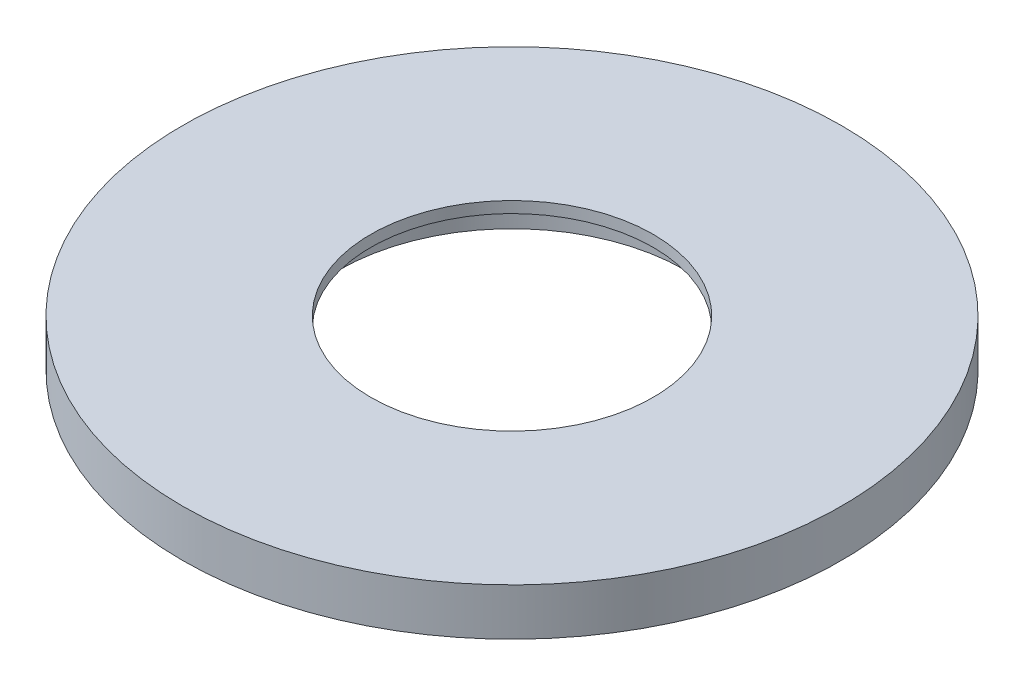
ISO-10303-21;
HEADER;
FILE_DESCRIPTION(('STEP AP214'),'2;1');
FILE_NAME('part.step','',(''),(''),'','','');
FILE_SCHEMA(('AUTOMOTIVE_DESIGN { 1 0 10303 214 1 1 1 1 }'));
ENDSEC;
DATA;
#1=APPLICATION_CONTEXT('core data for automotive mechanical design processes');
#2=APPLICATION_PROTOCOL_DEFINITION('international standard','automotive_design',2000,#1);
#3=PRODUCT_CONTEXT('',#1,'mechanical');
#4=PRODUCT('Part','Part','',(#3));
#5=PRODUCT_RELATED_PRODUCT_CATEGORY('part','',(#4));
#6=PRODUCT_DEFINITION_FORMATION('','',#4);
#7=PRODUCT_DEFINITION_CONTEXT('part definition',#1,'design');
#8=PRODUCT_DEFINITION('design','',#6,#7);
#9=PRODUCT_DEFINITION_SHAPE('','',#8);
#10=(LENGTH_UNIT() NAMED_UNIT(*) SI_UNIT(.MILLI.,.METRE.));
#11=(NAMED_UNIT(*) PLANE_ANGLE_UNIT() SI_UNIT($,.RADIAN.));
#12=(NAMED_UNIT(*) SI_UNIT($,.STERADIAN.) SOLID_ANGLE_UNIT());
#13=UNCERTAINTY_MEASURE_WITH_UNIT(LENGTH_MEASURE(1.E-05),#10,'distance_accuracy_value','');
#14=(GEOMETRIC_REPRESENTATION_CONTEXT(3) GLOBAL_UNCERTAINTY_ASSIGNED_CONTEXT((#13)) GLOBAL_UNIT_ASSIGNED_CONTEXT((#10,
#11,#12)) REPRESENTATION_CONTEXT('',''));
#15=CARTESIAN_POINT('',(0.,0.,0.));
#16=DIRECTION('',(0.,0.,1.));
#17=DIRECTION('',(1.,0.,0.));
#18=AXIS2_PLACEMENT_3D('',#15,#16,#17);
#19=CARTESIAN_POINT('',(-21.3837342069294,2.5,0.621346488799904));
#20=DIRECTION('',(0.,-1.,0.));
#21=DIRECTION('',(0.,0.,-1.));
#22=AXIS2_PLACEMENT_3D('',#19,#20,#21);
#23=CYLINDRICAL_SURFACE('',#22,9.2);
#24=CARTESIAN_POINT('',(-21.3837342069294,0.,0.621346488799904));
#25=DIRECTION('',(0.,1.,0.));
#26=DIRECTION('',(0.,0.,1.));
#27=AXIS2_PLACEMENT_3D('',#24,#25,#26);
#28=CIRCLE('',#27,9.2);
#29=CARTESIAN_POINT('',(-21.3837342069294,0.,9.8213464887999));
#30=VERTEX_POINT('',#29);
#31=EDGE_CURVE('E46',#30,#30,#28,.T.);
#32=ORIENTED_EDGE('',*,*,#31,.F.);
#33=EDGE_LOOP('',(#32));
#34=FACE_BOUND('',#33,.T.);
#35=CARTESIAN_POINT('',(-21.3837342069294,1.9,0.621346488799904));
#36=DIRECTION('',(0.,1.,0.));
#37=DIRECTION('',(0.,0.,1.));
#38=AXIS2_PLACEMENT_3D('',#35,#36,#37);
#39=CIRCLE('',#38,9.2);
#40=CARTESIAN_POINT('',(-21.3837342069294,1.9,9.8213464887999));
#41=VERTEX_POINT('',#40);
#42=EDGE_CURVE('E51',#41,#41,#39,.F.);
#43=ORIENTED_EDGE('',*,*,#42,.F.);
#44=EDGE_LOOP('',(#43));
#45=FACE_BOUND('',#44,.T.);
#46=ADVANCED_FACE('F35',(#34,#45),#23,.F.);
#47=CARTESIAN_POINT('',(-21.3837342069294,2.5,0.621346488799904));
#48=DIRECTION('',(0.,-1.,0.));
#49=DIRECTION('',(0.,0.,-1.));
#50=AXIS2_PLACEMENT_3D('',#47,#48,#49);
#51=CYLINDRICAL_SURFACE('',#50,17.5);
#52=CARTESIAN_POINT('',(-21.3837342069294,2.5,0.621346488799904));
#53=DIRECTION('',(0.,1.,0.));
#54=DIRECTION('',(0.,0.,1.));
#55=AXIS2_PLACEMENT_3D('',#52,#53,#54);
#56=CIRCLE('',#55,17.5);
#57=CARTESIAN_POINT('',(-21.3837342069294,2.5,18.1213464887999));
#58=VERTEX_POINT('',#57);
#59=EDGE_CURVE('E10',#58,#58,#56,.T.);
#60=ORIENTED_EDGE('',*,*,#59,.F.);
#61=EDGE_LOOP('',(#60));
#62=FACE_BOUND('',#61,.T.);
#63=CARTESIAN_POINT('',(-21.3837342069294,0.,0.621346488799904));
#64=DIRECTION('',(0.,1.,0.));
#65=DIRECTION('',(0.,0.,1.));
#66=AXIS2_PLACEMENT_3D('',#63,#64,#65);
#67=CIRCLE('',#66,17.5);
#68=CARTESIAN_POINT('',(-21.3837342069294,0.,18.1213464887999));
#69=VERTEX_POINT('',#68);
#70=EDGE_CURVE('E38',#69,#69,#67,.T.);
#71=ORIENTED_EDGE('',*,*,#70,.T.);
#72=EDGE_LOOP('',(#71));
#73=FACE_BOUND('',#72,.T.);
#74=ADVANCED_FACE('F109',(#62,#73),#51,.T.);
#75=CARTESIAN_POINT('',(0.,2.5,0.));
#76=DIRECTION('',(0.,1.,0.));
#77=DIRECTION('',(0.,0.,1.));
#78=AXIS2_PLACEMENT_3D('',#75,#76,#77);
#79=PLANE('',#78);
#80=ORIENTED_EDGE('',*,*,#59,.T.);
#81=EDGE_LOOP('',(#80));
#82=FACE_BOUND('',#81,.T.);
#83=CARTESIAN_POINT('',(-21.3837342069294,2.5,0.621346488799904));
#84=DIRECTION('',(0.,1.,0.));
#85=DIRECTION('',(0.,0.,1.));
#86=AXIS2_PLACEMENT_3D('',#83,#84,#85);
#87=CIRCLE('',#86,7.5);
#88=CARTESIAN_POINT('',(-21.3837342069294,2.5,8.1213464887999));
#89=VERTEX_POINT('',#88);
#90=EDGE_CURVE('E48',#89,#89,#87,.T.);
#91=ORIENTED_EDGE('',*,*,#90,.F.);
#92=EDGE_LOOP('',(#91));
#93=FACE_BOUND('',#92,.T.);
#94=ADVANCED_FACE('F99',(#82,#93),#79,.T.);
#95=CARTESIAN_POINT('',(0.,0.,0.));
#96=DIRECTION('',(0.,1.,0.));
#97=DIRECTION('',(0.,0.,1.));
#98=AXIS2_PLACEMENT_3D('',#95,#96,#97);
#99=PLANE('',#98);
#100=CARTESIAN_POINT('',(-36.352036057223,0.,0.435404850908226));
#101=DIRECTION('',(0.,-1.,0.));
#102=DIRECTION('',(1.,0.,0.));
#103=AXIS2_PLACEMENT_3D('',#100,#101,#102);
#104=CIRCLE('',#103,1.67);
#105=CARTESIAN_POINT('',(-34.682036057223,0.,0.435404850908209));
#106=VERTEX_POINT('',#105);
#107=EDGE_CURVE('E80',#106,#106,#104,.T.);
#108=ORIENTED_EDGE('',*,*,#107,.F.);
#109=EDGE_LOOP('',(#108));
#110=FACE_BOUND('',#109,.T.);
#111=CARTESIAN_POINT('',(-21.1977925690376,0.,-14.3469553614937));
#112=DIRECTION('',(0.,-1.,0.));
#113=DIRECTION('',(0.,0.,1.));
#114=AXIS2_PLACEMENT_3D('',#111,#112,#113);
#115=CIRCLE('',#114,1.67);
#116=CARTESIAN_POINT('',(-21.1977925690376,0.,-12.6769553614937));
#117=VERTEX_POINT('',#116);
#118=EDGE_CURVE('E74',#117,#117,#115,.T.);
#119=ORIENTED_EDGE('',*,*,#118,.F.);
#120=EDGE_LOOP('',(#119));
#121=FACE_BOUND('',#120,.T.);
#122=CARTESIAN_POINT('',(-6.41543235663587,0.,0.807288126691688));
#123=DIRECTION('',(0.,-1.,0.));
#124=DIRECTION('',(-1.,0.,0.));
#125=AXIS2_PLACEMENT_3D('',#122,#123,#124);
#126=CIRCLE('',#125,1.67);
#127=CARTESIAN_POINT('',(-8.08543235663587,0.,0.807288126691694));
#128=VERTEX_POINT('',#127);
#129=EDGE_CURVE('E68',#128,#128,#126,.T.);
#130=ORIENTED_EDGE('',*,*,#129,.F.);
#131=EDGE_LOOP('',(#130));
#132=FACE_BOUND('',#131,.T.);
#133=CARTESIAN_POINT('',(-21.5696758448213,0.,15.5896483390935));
#134=DIRECTION('',(0.,-1.,0.));
#135=DIRECTION('',(0.,0.,-1.));
#136=AXIS2_PLACEMENT_3D('',#133,#134,#135);
#137=CIRCLE('',#136,1.67);
#138=CARTESIAN_POINT('',(-21.5696758448213,0.,13.9196483390935));
#139=VERTEX_POINT('',#138);
#140=EDGE_CURVE('E61',#139,#139,#137,.T.);
#141=ORIENTED_EDGE('',*,*,#140,.F.);
#142=EDGE_LOOP('',(#141));
#143=FACE_BOUND('',#142,.T.);
#144=ORIENTED_EDGE('',*,*,#31,.T.);
#145=EDGE_LOOP('',(#144));
#146=FACE_BOUND('',#145,.T.);
#147=ORIENTED_EDGE('',*,*,#70,.F.);
#148=EDGE_LOOP('',(#147));
#149=FACE_BOUND('',#148,.T.);
#150=ADVANCED_FACE('F95',(#110,#121,#132,#143,#146,#149),#99,.F.);
#151=CARTESIAN_POINT('',(-21.3837342069294,1.9,0.621346488799904));
#152=DIRECTION('',(0.,1.,0.));
#153=DIRECTION('',(0.,0.,1.));
#154=AXIS2_PLACEMENT_3D('',#151,#152,#153);
#155=CYLINDRICAL_SURFACE('',#154,7.5);
#156=CARTESIAN_POINT('',(-21.3837342069294,1.9,0.621346488799904));
#157=DIRECTION('',(0.,1.,0.));
#158=DIRECTION('',(0.,0.,1.));
#159=AXIS2_PLACEMENT_3D('',#156,#157,#158);
#160=CIRCLE('',#159,7.5);
#161=CARTESIAN_POINT('',(-21.3837342069294,1.9,8.1213464887999));
#162=VERTEX_POINT('',#161);
#163=EDGE_CURVE('E55',#162,#162,#160,.T.);
#164=ORIENTED_EDGE('',*,*,#163,.F.);
#165=EDGE_LOOP('',(#164));
#166=FACE_BOUND('',#165,.T.);
#167=ORIENTED_EDGE('',*,*,#90,.T.);
#168=EDGE_LOOP('',(#167));
#169=FACE_BOUND('',#168,.T.);
#170=ADVANCED_FACE('F98',(#166,#169),#155,.F.);
#171=CARTESIAN_POINT('',(0.,1.9,0.));
#172=DIRECTION('',(0.,1.,0.));
#173=DIRECTION('',(0.,0.,1.));
#174=AXIS2_PLACEMENT_3D('',#171,#172,#173);
#175=PLANE('',#174);
#176=ORIENTED_EDGE('',*,*,#163,.T.);
#177=EDGE_LOOP('',(#176));
#178=FACE_BOUND('',#177,.T.);
#179=ORIENTED_EDGE('',*,*,#42,.T.);
#180=EDGE_LOOP('',(#179));
#181=FACE_BOUND('',#180,.T.);
#182=ADVANCED_FACE('F121',(#178,#181),#175,.F.);
#183=CARTESIAN_POINT('',(-21.5696758448213,1.15,15.5896483390935));
#184=DIRECTION('',(0.,-1.,0.));
#185=DIRECTION('',(0.,0.,-1.));
#186=AXIS2_PLACEMENT_3D('',#183,#184,#185);
#187=CYLINDRICAL_SURFACE('',#186,1.67);
#188=CARTESIAN_POINT('',(-21.5696758448213,1.15,15.5896483390935));
#189=DIRECTION('',(0.,-1.,0.));
#190=DIRECTION('',(0.,0.,-1.));
#191=AXIS2_PLACEMENT_3D('',#188,#189,#190);
#192=CIRCLE('',#191,1.67);
#193=CARTESIAN_POINT('',(-21.5696758448213,1.15,13.9196483390935));
#194=VERTEX_POINT('',#193);
#195=EDGE_CURVE('E64',#194,#194,#192,.T.);
#196=ORIENTED_EDGE('',*,*,#195,.F.);
#197=EDGE_LOOP('',(#196));
#198=FACE_BOUND('',#197,.T.);
#199=ORIENTED_EDGE('',*,*,#140,.T.);
#200=EDGE_LOOP('',(#199));
#201=FACE_BOUND('',#200,.T.);
#202=ADVANCED_FACE('F125',(#198,#201),#187,.F.);
#203=CARTESIAN_POINT('',(-21.5696758448213,1.15,15.5896483390935));
#204=DIRECTION('',(0.,-1.,0.));
#205=DIRECTION('',(0.,0.,-1.));
#206=AXIS2_PLACEMENT_3D('',#203,#204,#205);
#207=PLANE('',#206);
#208=ORIENTED_EDGE('',*,*,#195,.T.);
#209=EDGE_LOOP('',(#208));
#210=FACE_BOUND('',#209,.T.);
#211=ADVANCED_FACE('F129',(#210),#207,.T.);
#212=CARTESIAN_POINT('',(-6.41543235663587,1.15,0.807288126691688));
#213=DIRECTION('',(0.,-1.,0.));
#214=DIRECTION('',(0.,0.,-1.));
#215=AXIS2_PLACEMENT_3D('',#212,#213,#214);
#216=CYLINDRICAL_SURFACE('',#215,1.67);
#217=CARTESIAN_POINT('',(-6.41543235663587,1.15,0.807288126691688));
#218=DIRECTION('',(0.,-1.,0.));
#219=DIRECTION('',(-1.,0.,0.));
#220=AXIS2_PLACEMENT_3D('',#217,#218,#219);
#221=CIRCLE('',#220,1.67);
#222=CARTESIAN_POINT('',(-8.08543235663587,1.15,0.807288126691694));
#223=VERTEX_POINT('',#222);
#224=EDGE_CURVE('E65',#223,#223,#221,.T.);
#225=ORIENTED_EDGE('',*,*,#224,.F.);
#226=EDGE_LOOP('',(#225));
#227=FACE_BOUND('',#226,.T.);
#228=ORIENTED_EDGE('',*,*,#129,.T.);
#229=EDGE_LOOP('',(#228));
#230=FACE_BOUND('',#229,.T.);
#231=ADVANCED_FACE('F133',(#227,#230),#216,.F.);
#232=CARTESIAN_POINT('',(-6.41543235663587,1.15,0.807288126691688));
#233=DIRECTION('',(0.,-1.,0.));
#234=DIRECTION('',(-1.,0.,0.));
#235=AXIS2_PLACEMENT_3D('',#232,#233,#234);
#236=PLANE('',#235);
#237=ORIENTED_EDGE('',*,*,#224,.T.);
#238=EDGE_LOOP('',(#237));
#239=FACE_BOUND('',#238,.T.);
#240=ADVANCED_FACE('F137',(#239),#236,.T.);
#241=CARTESIAN_POINT('',(-21.1977925690376,1.15,-14.3469553614937));
#242=DIRECTION('',(0.,-1.,0.));
#243=DIRECTION('',(0.,0.,-1.));
#244=AXIS2_PLACEMENT_3D('',#241,#242,#243);
#245=CYLINDRICAL_SURFACE('',#244,1.67);
#246=CARTESIAN_POINT('',(-21.1977925690376,1.15,-14.3469553614937));
#247=DIRECTION('',(0.,-1.,0.));
#248=DIRECTION('',(0.,0.,1.));
#249=AXIS2_PLACEMENT_3D('',#246,#247,#248);
#250=CIRCLE('',#249,1.67);
#251=CARTESIAN_POINT('',(-21.1977925690376,1.15,-12.6769553614937));
#252=VERTEX_POINT('',#251);
#253=EDGE_CURVE('E71',#252,#252,#250,.T.);
#254=ORIENTED_EDGE('',*,*,#253,.F.);
#255=EDGE_LOOP('',(#254));
#256=FACE_BOUND('',#255,.T.);
#257=ORIENTED_EDGE('',*,*,#118,.T.);
#258=EDGE_LOOP('',(#257));
#259=FACE_BOUND('',#258,.T.);
#260=ADVANCED_FACE('F141',(#256,#259),#245,.F.);
#261=CARTESIAN_POINT('',(-21.1977925690376,1.15,-14.3469553614937));
#262=DIRECTION('',(0.,-1.,0.));
#263=DIRECTION('',(0.,0.,1.));
#264=AXIS2_PLACEMENT_3D('',#261,#262,#263);
#265=PLANE('',#264);
#266=ORIENTED_EDGE('',*,*,#253,.T.);
#267=EDGE_LOOP('',(#266));
#268=FACE_BOUND('',#267,.T.);
#269=ADVANCED_FACE('F91',(#268),#265,.T.);
#270=CARTESIAN_POINT('',(-36.352036057223,1.15,0.435404850908226));
#271=DIRECTION('',(0.,-1.,0.));
#272=DIRECTION('',(0.,0.,-1.));
#273=AXIS2_PLACEMENT_3D('',#270,#271,#272);
#274=CYLINDRICAL_SURFACE('',#273,1.67);
#275=CARTESIAN_POINT('',(-36.352036057223,1.15,0.435404850908226));
#276=DIRECTION('',(0.,-1.,0.));
#277=DIRECTION('',(1.,0.,0.));
#278=AXIS2_PLACEMENT_3D('',#275,#276,#277);
#279=CIRCLE('',#278,1.67);
#280=CARTESIAN_POINT('',(-34.682036057223,1.15,0.435404850908209));
#281=VERTEX_POINT('',#280);
#282=EDGE_CURVE('E77',#281,#281,#279,.T.);
#283=ORIENTED_EDGE('',*,*,#282,.F.);
#284=EDGE_LOOP('',(#283));
#285=FACE_BOUND('',#284,.T.);
#286=ORIENTED_EDGE('',*,*,#107,.T.);
#287=EDGE_LOOP('',(#286));
#288=FACE_BOUND('',#287,.T.);
#289=ADVANCED_FACE('F88',(#285,#288),#274,.F.);
#290=CARTESIAN_POINT('',(-36.352036057223,1.15,0.435404850908226));
#291=DIRECTION('',(0.,-1.,0.));
#292=DIRECTION('',(1.,0.,0.));
#293=AXIS2_PLACEMENT_3D('',#290,#291,#292);
#294=PLANE('',#293);
#295=ORIENTED_EDGE('',*,*,#282,.T.);
#296=EDGE_LOOP('',(#295));
#297=FACE_BOUND('',#296,.T.);
#298=ADVANCED_FACE('F86',(#297),#294,.T.);
#299=CLOSED_SHELL('',(#46,#74,#94,#150,#170,#182,#202,#211,#231,#240,#260,#269,#289,#298));
#300=MANIFOLD_SOLID_BREP('B2',#299);
#301=ADVANCED_BREP_SHAPE_REPRESENTATION('',(#18,#300),#14);
#302=SHAPE_DEFINITION_REPRESENTATION(#9,#301);
ENDSEC;
END-ISO-10303-21;
